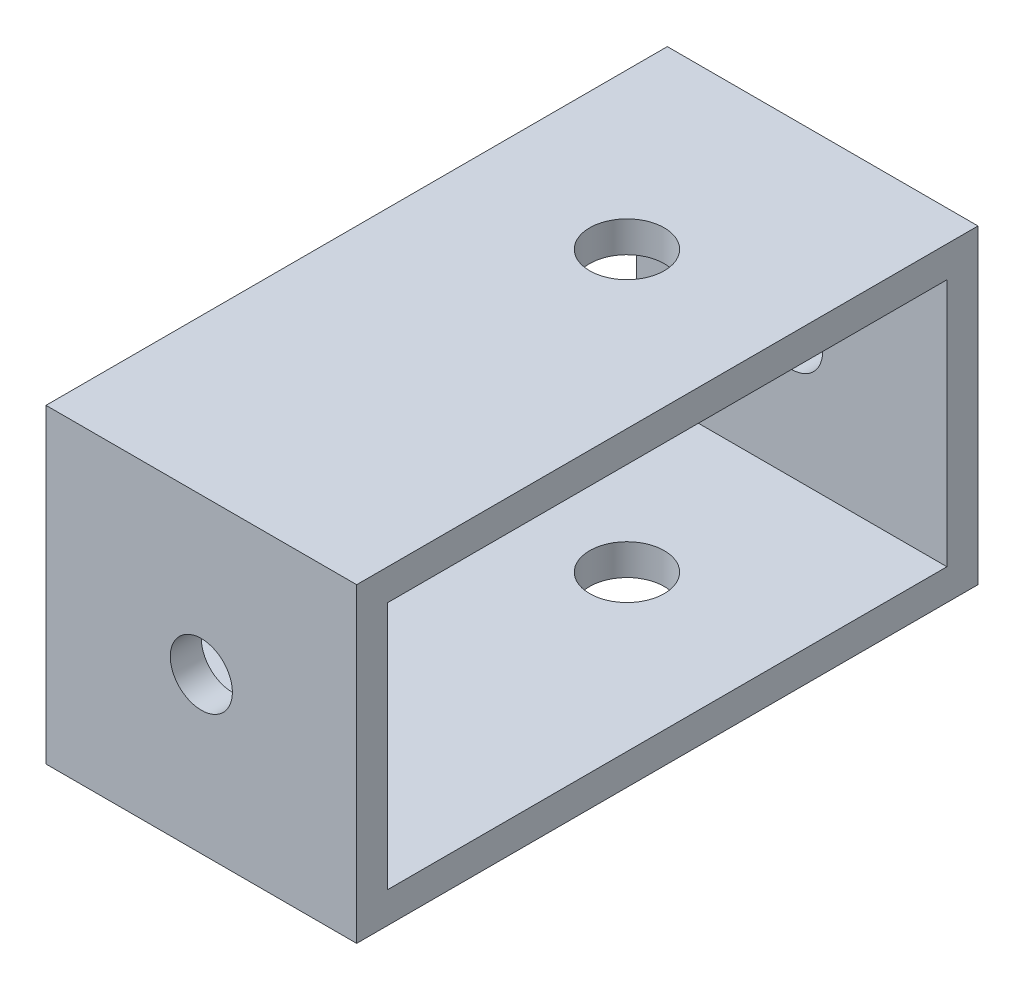
ISO-10303-21;
HEADER;
FILE_DESCRIPTION(('STEP AP214'),'2;1');
FILE_NAME('part.step','',(''),(''),'','','');
FILE_SCHEMA(('AUTOMOTIVE_DESIGN { 1 0 10303 214 1 1 1 1 }'));
ENDSEC;
DATA;
#1=APPLICATION_CONTEXT('core data for automotive mechanical design processes');
#2=APPLICATION_PROTOCOL_DEFINITION('international standard','automotive_design',2000,#1);
#3=PRODUCT_CONTEXT('',#1,'mechanical');
#4=PRODUCT('Part','Part','',(#3));
#5=PRODUCT_RELATED_PRODUCT_CATEGORY('part','',(#4));
#6=PRODUCT_DEFINITION_FORMATION('','',#4);
#7=PRODUCT_DEFINITION_CONTEXT('part definition',#1,'design');
#8=PRODUCT_DEFINITION('design','',#6,#7);
#9=PRODUCT_DEFINITION_SHAPE('','',#8);
#10=(LENGTH_UNIT() NAMED_UNIT(*) SI_UNIT(.MILLI.,.METRE.));
#11=(NAMED_UNIT(*) PLANE_ANGLE_UNIT() SI_UNIT($,.RADIAN.));
#12=(NAMED_UNIT(*) SI_UNIT($,.STERADIAN.) SOLID_ANGLE_UNIT());
#13=UNCERTAINTY_MEASURE_WITH_UNIT(LENGTH_MEASURE(1.E-05),#10,'distance_accuracy_value','');
#14=(GEOMETRIC_REPRESENTATION_CONTEXT(3) GLOBAL_UNCERTAINTY_ASSIGNED_CONTEXT((#13)) GLOBAL_UNIT_ASSIGNED_CONTEXT((#10,
#11,#12)) REPRESENTATION_CONTEXT('',''));
#15=CARTESIAN_POINT('',(0.,0.,0.));
#16=DIRECTION('',(0.,0.,1.));
#17=DIRECTION('',(1.,0.,0.));
#18=AXIS2_PLACEMENT_3D('',#15,#16,#17);
#19=CARTESIAN_POINT('',(25.4,25.4,0.));
#20=DIRECTION('',(0.,1.,0.));
#21=DIRECTION('',(0.,0.,1.));
#22=AXIS2_PLACEMENT_3D('',#19,#20,#21);
#23=PLANE('',#22);
#24=CARTESIAN_POINT('',(12.7,25.4,-34.798));
#25=DIRECTION('',(0.,1.,0.));
#26=DIRECTION('',(0.,0.,1.));
#27=AXIS2_PLACEMENT_3D('',#24,#25,#26);
#28=CIRCLE('',#27,3.048);
#29=CARTESIAN_POINT('',(12.7,25.4,-31.75));
#30=VERTEX_POINT('',#29);
#31=EDGE_CURVE('E202',#30,#30,#28,.T.);
#32=ORIENTED_EDGE('',*,*,#31,.F.);
#33=EDGE_LOOP('',(#32));
#34=FACE_BOUND('',#33,.T.);
#35=DIRECTION('',(0.,0.,-1.));
#36=VECTOR('',#35,1.);
#37=CARTESIAN_POINT('',(0.,25.4,0.));
#38=LINE('',#37,#36);
#39=CARTESIAN_POINT('',(0.,25.4,0.));
#40=VERTEX_POINT('',#39);
#41=CARTESIAN_POINT('',(0.,25.4,-50.8));
#42=VERTEX_POINT('',#41);
#43=EDGE_CURVE('E166',#40,#42,#38,.T.);
#44=ORIENTED_EDGE('',*,*,#43,.F.);
#45=DIRECTION('',(-1.,0.,0.));
#46=VECTOR('',#45,1.);
#47=CARTESIAN_POINT('',(25.4,25.4,0.));
#48=LINE('',#47,#46);
#49=CARTESIAN_POINT('',(25.4,25.4,0.));
#50=VERTEX_POINT('',#49);
#51=EDGE_CURVE('E12',#50,#40,#48,.T.);
#52=ORIENTED_EDGE('',*,*,#51,.F.);
#53=DIRECTION('',(0.,0.,-1.));
#54=VECTOR('',#53,1.);
#55=CARTESIAN_POINT('',(25.4,25.4,0.));
#56=LINE('',#55,#54);
#57=CARTESIAN_POINT('',(25.4,25.4,-50.8));
#58=VERTEX_POINT('',#57);
#59=EDGE_CURVE('E170',#50,#58,#56,.T.);
#60=ORIENTED_EDGE('',*,*,#59,.T.);
#61=DIRECTION('',(-1.,0.,0.));
#62=VECTOR('',#61,1.);
#63=CARTESIAN_POINT('',(25.4,25.4,-50.8));
#64=LINE('',#63,#62);
#65=EDGE_CURVE('E181',#58,#42,#64,.T.);
#66=ORIENTED_EDGE('',*,*,#65,.T.);
#67=EDGE_LOOP('',(#44,#52,#60,#66));
#68=FACE_BOUND('',#67,.T.);
#69=ADVANCED_FACE('F67',(#34,#68),#23,.T.);
#70=CARTESIAN_POINT('',(25.4,25.4,0.));
#71=DIRECTION('',(0.,0.,-1.));
#72=DIRECTION('',(0.,1.,0.));
#73=AXIS2_PLACEMENT_3D('',#70,#71,#72);
#74=PLANE('',#73);
#75=CARTESIAN_POINT('',(12.7,12.7,0.));
#76=DIRECTION('',(0.,0.,1.));
#77=DIRECTION('',(1.,0.,0.));
#78=AXIS2_PLACEMENT_3D('',#75,#76,#77);
#79=CIRCLE('',#78,2.54);
#80=CARTESIAN_POINT('',(15.24,12.7,0.));
#81=VERTEX_POINT('',#80);
#82=EDGE_CURVE('E211',#81,#81,#79,.T.);
#83=ORIENTED_EDGE('',*,*,#82,.F.);
#84=EDGE_LOOP('',(#83));
#85=FACE_BOUND('',#84,.T.);
#86=DIRECTION('',(0.,-1.,0.));
#87=VECTOR('',#86,1.);
#88=CARTESIAN_POINT('',(0.,25.4,0.));
#89=LINE('',#88,#87);
#90=CARTESIAN_POINT('',(0.,0.,0.));
#91=VERTEX_POINT('',#90);
#92=EDGE_CURVE('E174',#40,#91,#89,.T.);
#93=ORIENTED_EDGE('',*,*,#92,.T.);
#94=DIRECTION('',(-1.,0.,0.));
#95=VECTOR('',#94,1.);
#96=CARTESIAN_POINT('',(25.4,0.,0.));
#97=LINE('',#96,#95);
#98=CARTESIAN_POINT('',(25.4,0.,0.));
#99=VERTEX_POINT('',#98);
#100=EDGE_CURVE('E75',#99,#91,#97,.T.);
#101=ORIENTED_EDGE('',*,*,#100,.F.);
#102=DIRECTION('',(0.,-1.,0.));
#103=VECTOR('',#102,1.);
#104=CARTESIAN_POINT('',(25.4,25.4,0.));
#105=LINE('',#104,#103);
#106=EDGE_CURVE('E179',#50,#99,#105,.T.);
#107=ORIENTED_EDGE('',*,*,#106,.F.);
#108=ORIENTED_EDGE('',*,*,#51,.T.);
#109=EDGE_LOOP('',(#93,#101,#107,#108));
#110=FACE_BOUND('',#109,.T.);
#111=ADVANCED_FACE('F237',(#85,#110),#74,.F.);
#112=CARTESIAN_POINT('',(25.4,0.,0.));
#113=DIRECTION('',(0.,1.,0.));
#114=DIRECTION('',(0.,0.,1.));
#115=AXIS2_PLACEMENT_3D('',#112,#113,#114);
#116=PLANE('',#115);
#117=CARTESIAN_POINT('',(12.7,0.,-34.798));
#118=DIRECTION('',(0.,1.,0.));
#119=DIRECTION('',(0.,0.,1.));
#120=AXIS2_PLACEMENT_3D('',#117,#118,#119);
#121=CIRCLE('',#120,3.048);
#122=CARTESIAN_POINT('',(12.7,0.,-31.75));
#123=VERTEX_POINT('',#122);
#124=EDGE_CURVE('E197',#123,#123,#121,.T.);
#125=ORIENTED_EDGE('',*,*,#124,.T.);
#126=EDGE_LOOP('',(#125));
#127=FACE_BOUND('',#126,.T.);
#128=DIRECTION('',(0.,0.,-1.));
#129=VECTOR('',#128,1.);
#130=CARTESIAN_POINT('',(0.,0.,0.));
#131=LINE('',#130,#129);
#132=CARTESIAN_POINT('',(0.,0.,-50.8));
#133=VERTEX_POINT('',#132);
#134=EDGE_CURVE('E187',#91,#133,#131,.T.);
#135=ORIENTED_EDGE('',*,*,#134,.T.);
#136=DIRECTION('',(-1.,0.,0.));
#137=VECTOR('',#136,1.);
#138=CARTESIAN_POINT('',(25.4,0.,-50.8));
#139=LINE('',#138,#137);
#140=CARTESIAN_POINT('',(25.4,0.,-50.8));
#141=VERTEX_POINT('',#140);
#142=EDGE_CURVE('E193',#141,#133,#139,.T.);
#143=ORIENTED_EDGE('',*,*,#142,.F.);
#144=DIRECTION('',(0.,0.,-1.));
#145=VECTOR('',#144,1.);
#146=CARTESIAN_POINT('',(25.4,0.,0.));
#147=LINE('',#146,#145);
#148=EDGE_CURVE('E177',#99,#141,#147,.T.);
#149=ORIENTED_EDGE('',*,*,#148,.F.);
#150=ORIENTED_EDGE('',*,*,#100,.T.);
#151=EDGE_LOOP('',(#135,#143,#149,#150));
#152=FACE_BOUND('',#151,.T.);
#153=ADVANCED_FACE('F242',(#127,#152),#116,.F.);
#154=CARTESIAN_POINT('',(25.4,25.4,-50.8));
#155=DIRECTION('',(0.,0.,-1.));
#156=DIRECTION('',(-1.,0.,0.));
#157=AXIS2_PLACEMENT_3D('',#154,#155,#156);
#158=PLANE('',#157);
#159=CARTESIAN_POINT('',(12.7,12.7,-50.8));
#160=DIRECTION('',(0.,0.,1.));
#161=DIRECTION('',(1.,0.,0.));
#162=AXIS2_PLACEMENT_3D('',#159,#160,#161);
#163=CIRCLE('',#162,2.54);
#164=CARTESIAN_POINT('',(15.24,12.7,-50.8));
#165=VERTEX_POINT('',#164);
#166=EDGE_CURVE('E214',#165,#165,#163,.T.);
#167=ORIENTED_EDGE('',*,*,#166,.T.);
#168=EDGE_LOOP('',(#167));
#169=FACE_BOUND('',#168,.T.);
#170=DIRECTION('',(0.,-1.,0.));
#171=VECTOR('',#170,1.);
#172=CARTESIAN_POINT('',(0.,25.4,-50.8));
#173=LINE('',#172,#171);
#174=EDGE_CURVE('E184',#42,#133,#173,.T.);
#175=ORIENTED_EDGE('',*,*,#174,.F.);
#176=ORIENTED_EDGE('',*,*,#65,.F.);
#177=DIRECTION('',(0.,-1.,0.));
#178=VECTOR('',#177,1.);
#179=CARTESIAN_POINT('',(25.4,25.4,-50.8));
#180=LINE('',#179,#178);
#181=EDGE_CURVE('E173',#58,#141,#180,.T.);
#182=ORIENTED_EDGE('',*,*,#181,.T.);
#183=ORIENTED_EDGE('',*,*,#142,.T.);
#184=EDGE_LOOP('',(#175,#176,#182,#183));
#185=FACE_BOUND('',#184,.T.);
#186=ADVANCED_FACE('F262',(#169,#185),#158,.T.);
#187=CARTESIAN_POINT('',(25.4,0.,0.));
#188=DIRECTION('',(-1.,0.,0.));
#189=DIRECTION('',(0.,0.,1.));
#190=AXIS2_PLACEMENT_3D('',#187,#188,#189);
#191=PLANE('',#190);
#192=DIRECTION('',(0.,-1.,0.));
#193=VECTOR('',#192,1.);
#194=CARTESIAN_POINT('',(25.4,22.86,-2.54));
#195=LINE('',#194,#193);
#196=CARTESIAN_POINT('',(25.4,22.86,-2.54));
#197=VERTEX_POINT('',#196);
#198=CARTESIAN_POINT('',(25.4,2.54,-2.54));
#199=VERTEX_POINT('',#198);
#200=EDGE_CURVE('E137',#197,#199,#195,.T.);
#201=ORIENTED_EDGE('',*,*,#200,.F.);
#202=DIRECTION('',(0.,0.,-1.));
#203=VECTOR('',#202,1.);
#204=CARTESIAN_POINT('',(25.4,22.86,-2.54));
#205=LINE('',#204,#203);
#206=CARTESIAN_POINT('',(25.4,22.86,-48.26));
#207=VERTEX_POINT('',#206);
#208=EDGE_CURVE('E134',#197,#207,#205,.T.);
#209=ORIENTED_EDGE('',*,*,#208,.T.);
#210=DIRECTION('',(0.,-1.,0.));
#211=VECTOR('',#210,1.);
#212=CARTESIAN_POINT('',(25.4,22.86,-48.26));
#213=LINE('',#212,#211);
#214=CARTESIAN_POINT('',(25.4,2.54,-48.26));
#215=VERTEX_POINT('',#214);
#216=EDGE_CURVE('E140',#207,#215,#213,.T.);
#217=ORIENTED_EDGE('',*,*,#216,.T.);
#218=DIRECTION('',(0.,0.,-1.));
#219=VECTOR('',#218,1.);
#220=CARTESIAN_POINT('',(25.4,2.54,-2.54));
#221=LINE('',#220,#219);
#222=EDGE_CURVE('E144',#199,#215,#221,.T.);
#223=ORIENTED_EDGE('',*,*,#222,.F.);
#224=EDGE_LOOP('',(#201,#209,#217,#223));
#225=FACE_BOUND('',#224,.T.);
#226=ORIENTED_EDGE('',*,*,#59,.F.);
#227=ORIENTED_EDGE('',*,*,#106,.T.);
#228=ORIENTED_EDGE('',*,*,#148,.T.);
#229=ORIENTED_EDGE('',*,*,#181,.F.);
#230=EDGE_LOOP('',(#226,#227,#228,#229));
#231=FACE_BOUND('',#230,.T.);
#232=ADVANCED_FACE('F146',(#225,#231),#191,.F.);
#233=CARTESIAN_POINT('',(0.,0.,0.));
#234=DIRECTION('',(-1.,0.,0.));
#235=DIRECTION('',(0.,0.,1.));
#236=AXIS2_PLACEMENT_3D('',#233,#234,#235);
#237=PLANE('',#236);
#238=DIRECTION('',(0.,0.,-1.));
#239=VECTOR('',#238,1.);
#240=CARTESIAN_POINT('',(0.,22.86,-2.54));
#241=LINE('',#240,#239);
#242=CARTESIAN_POINT('',(0.,22.86,-2.54));
#243=VERTEX_POINT('',#242);
#244=CARTESIAN_POINT('',(0.,22.86,-48.26));
#245=VERTEX_POINT('',#244);
#246=EDGE_CURVE('E91',#243,#245,#241,.T.);
#247=ORIENTED_EDGE('',*,*,#246,.F.);
#248=DIRECTION('',(0.,-1.,0.));
#249=VECTOR('',#248,1.);
#250=CARTESIAN_POINT('',(0.,22.86,-2.54));
#251=LINE('',#250,#249);
#252=CARTESIAN_POINT('',(0.,2.54,-2.54));
#253=VERTEX_POINT('',#252);
#254=EDGE_CURVE('E148',#243,#253,#251,.T.);
#255=ORIENTED_EDGE('',*,*,#254,.T.);
#256=DIRECTION('',(0.,0.,-1.));
#257=VECTOR('',#256,1.);
#258=CARTESIAN_POINT('',(0.,2.54,-2.54));
#259=LINE('',#258,#257);
#260=CARTESIAN_POINT('',(0.,2.54,-48.26));
#261=VERTEX_POINT('',#260);
#262=EDGE_CURVE('E151',#253,#261,#259,.T.);
#263=ORIENTED_EDGE('',*,*,#262,.T.);
#264=DIRECTION('',(0.,-1.,0.));
#265=VECTOR('',#264,1.);
#266=CARTESIAN_POINT('',(0.,22.86,-48.26));
#267=LINE('',#266,#265);
#268=EDGE_CURVE('E160',#245,#261,#267,.T.);
#269=ORIENTED_EDGE('',*,*,#268,.F.);
#270=EDGE_LOOP('',(#247,#255,#263,#269));
#271=FACE_BOUND('',#270,.T.);
#272=ORIENTED_EDGE('',*,*,#43,.T.);
#273=ORIENTED_EDGE('',*,*,#174,.T.);
#274=ORIENTED_EDGE('',*,*,#134,.F.);
#275=ORIENTED_EDGE('',*,*,#92,.F.);
#276=EDGE_LOOP('',(#272,#273,#274,#275));
#277=FACE_BOUND('',#276,.T.);
#278=ADVANCED_FACE('F252',(#271,#277),#237,.T.);
#279=CARTESIAN_POINT('',(25.4,22.86,-2.54));
#280=DIRECTION('',(0.,1.,0.));
#281=DIRECTION('',(0.,0.,1.));
#282=AXIS2_PLACEMENT_3D('',#279,#280,#281);
#283=PLANE('',#282);
#284=CARTESIAN_POINT('',(12.7,22.86,-34.798));
#285=DIRECTION('',(0.,1.,0.));
#286=DIRECTION('',(0.,0.,1.));
#287=AXIS2_PLACEMENT_3D('',#284,#285,#286);
#288=CIRCLE('',#287,3.048);
#289=CARTESIAN_POINT('',(12.7,22.86,-31.75));
#290=VERTEX_POINT('',#289);
#291=EDGE_CURVE('E154',#290,#290,#288,.T.);
#292=ORIENTED_EDGE('',*,*,#291,.T.);
#293=EDGE_LOOP('',(#292));
#294=FACE_BOUND('',#293,.T.);
#295=ORIENTED_EDGE('',*,*,#246,.T.);
#296=DIRECTION('',(-1.,0.,0.));
#297=VECTOR('',#296,1.);
#298=CARTESIAN_POINT('',(25.4,22.86,-48.26));
#299=LINE('',#298,#297);
#300=EDGE_CURVE('E131',#207,#245,#299,.T.);
#301=ORIENTED_EDGE('',*,*,#300,.F.);
#302=ORIENTED_EDGE('',*,*,#208,.F.);
#303=DIRECTION('',(-1.,0.,0.));
#304=VECTOR('',#303,1.);
#305=CARTESIAN_POINT('',(25.4,22.86,-2.54));
#306=LINE('',#305,#304);
#307=EDGE_CURVE('E164',#197,#243,#306,.T.);
#308=ORIENTED_EDGE('',*,*,#307,.T.);
#309=EDGE_LOOP('',(#295,#301,#302,#308));
#310=FACE_BOUND('',#309,.T.);
#311=ADVANCED_FACE('F132',(#294,#310),#283,.F.);
#312=CARTESIAN_POINT('',(25.4,22.86,-2.54));
#313=DIRECTION('',(0.,0.,-1.));
#314=DIRECTION('',(-1.,0.,0.));
#315=AXIS2_PLACEMENT_3D('',#312,#313,#314);
#316=PLANE('',#315);
#317=CARTESIAN_POINT('',(12.7,12.7,-2.54));
#318=DIRECTION('',(0.,0.,-1.));
#319=DIRECTION('',(-1.,0.,0.));
#320=AXIS2_PLACEMENT_3D('',#317,#318,#319);
#321=CIRCLE('',#320,2.54);
#322=CARTESIAN_POINT('',(10.16,12.7,-2.54));
#323=VERTEX_POINT('',#322);
#324=EDGE_CURVE('E207',#323,#323,#321,.T.);
#325=ORIENTED_EDGE('',*,*,#324,.F.);
#326=EDGE_LOOP('',(#325));
#327=FACE_BOUND('',#326,.T.);
#328=ORIENTED_EDGE('',*,*,#254,.F.);
#329=ORIENTED_EDGE('',*,*,#307,.F.);
#330=ORIENTED_EDGE('',*,*,#200,.T.);
#331=DIRECTION('',(-1.,0.,0.));
#332=VECTOR('',#331,1.);
#333=CARTESIAN_POINT('',(25.4,2.54,-2.54));
#334=LINE('',#333,#332);
#335=EDGE_CURVE('E167',#199,#253,#334,.T.);
#336=ORIENTED_EDGE('',*,*,#335,.T.);
#337=EDGE_LOOP('',(#328,#329,#330,#336));
#338=FACE_BOUND('',#337,.T.);
#339=ADVANCED_FACE('F276',(#327,#338),#316,.T.);
#340=CARTESIAN_POINT('',(25.4,2.54,-2.54));
#341=DIRECTION('',(0.,1.,0.));
#342=DIRECTION('',(0.,0.,1.));
#343=AXIS2_PLACEMENT_3D('',#340,#341,#342);
#344=PLANE('',#343);
#345=CARTESIAN_POINT('',(12.7,2.54,-34.798));
#346=DIRECTION('',(0.,1.,0.));
#347=DIRECTION('',(0.,0.,1.));
#348=AXIS2_PLACEMENT_3D('',#345,#346,#347);
#349=CIRCLE('',#348,3.048);
#350=CARTESIAN_POINT('',(12.7,2.54,-31.75));
#351=VERTEX_POINT('',#350);
#352=EDGE_CURVE('E195',#351,#351,#349,.T.);
#353=ORIENTED_EDGE('',*,*,#352,.F.);
#354=EDGE_LOOP('',(#353));
#355=FACE_BOUND('',#354,.T.);
#356=ORIENTED_EDGE('',*,*,#262,.F.);
#357=ORIENTED_EDGE('',*,*,#335,.F.);
#358=ORIENTED_EDGE('',*,*,#222,.T.);
#359=DIRECTION('',(-1.,0.,0.));
#360=VECTOR('',#359,1.);
#361=CARTESIAN_POINT('',(25.4,2.54,-48.26));
#362=LINE('',#361,#360);
#363=EDGE_CURVE('E83',#215,#261,#362,.T.);
#364=ORIENTED_EDGE('',*,*,#363,.T.);
#365=EDGE_LOOP('',(#356,#357,#358,#364));
#366=FACE_BOUND('',#365,.T.);
#367=ADVANCED_FACE('F280',(#355,#366),#344,.T.);
#368=CARTESIAN_POINT('',(25.4,22.86,-48.26));
#369=DIRECTION('',(0.,0.,-1.));
#370=DIRECTION('',(-1.,0.,0.));
#371=AXIS2_PLACEMENT_3D('',#368,#369,#370);
#372=PLANE('',#371);
#373=CARTESIAN_POINT('',(12.7,12.7,-48.26));
#374=DIRECTION('',(0.,0.,-1.));
#375=DIRECTION('',(-1.,0.,0.));
#376=AXIS2_PLACEMENT_3D('',#373,#374,#375);
#377=CIRCLE('',#376,2.54);
#378=CARTESIAN_POINT('',(10.16,12.7,-48.26));
#379=VERTEX_POINT('',#378);
#380=EDGE_CURVE('E70',#379,#379,#377,.T.);
#381=ORIENTED_EDGE('',*,*,#380,.T.);
#382=EDGE_LOOP('',(#381));
#383=FACE_BOUND('',#382,.T.);
#384=ORIENTED_EDGE('',*,*,#268,.T.);
#385=ORIENTED_EDGE('',*,*,#363,.F.);
#386=ORIENTED_EDGE('',*,*,#216,.F.);
#387=ORIENTED_EDGE('',*,*,#300,.T.);
#388=EDGE_LOOP('',(#384,#385,#386,#387));
#389=FACE_BOUND('',#388,.T.);
#390=ADVANCED_FACE('F141',(#383,#389),#372,.F.);
#391=CARTESIAN_POINT('',(12.7,0.,-34.798));
#392=DIRECTION('',(0.,1.,0.));
#393=DIRECTION('',(0.,0.,1.));
#394=AXIS2_PLACEMENT_3D('',#391,#392,#393);
#395=CYLINDRICAL_SURFACE('',#394,3.048);
#396=ORIENTED_EDGE('',*,*,#352,.T.);
#397=EDGE_LOOP('',(#396));
#398=FACE_BOUND('',#397,.T.);
#399=ORIENTED_EDGE('',*,*,#124,.F.);
#400=EDGE_LOOP('',(#399));
#401=FACE_BOUND('',#400,.T.);
#402=ADVANCED_FACE('F233',(#398,#401),#395,.F.);
#403=ORIENTED_EDGE('',*,*,#31,.T.);
#404=EDGE_LOOP('',(#403));
#405=FACE_BOUND('',#404,.T.);
#406=ORIENTED_EDGE('',*,*,#291,.F.);
#407=EDGE_LOOP('',(#406));
#408=FACE_BOUND('',#407,.T.);
#409=ADVANCED_FACE('F225',(#405,#408),#395,.F.);
#410=CARTESIAN_POINT('',(12.7,12.7,-50.8));
#411=DIRECTION('',(0.,0.,1.));
#412=DIRECTION('',(1.,0.,0.));
#413=AXIS2_PLACEMENT_3D('',#410,#411,#412);
#414=CYLINDRICAL_SURFACE('',#413,2.54);
#415=ORIENTED_EDGE('',*,*,#166,.F.);
#416=EDGE_LOOP('',(#415));
#417=FACE_BOUND('',#416,.T.);
#418=ORIENTED_EDGE('',*,*,#380,.F.);
#419=EDGE_LOOP('',(#418));
#420=FACE_BOUND('',#419,.T.);
#421=ADVANCED_FACE('F222',(#417,#420),#414,.F.);
#422=ORIENTED_EDGE('',*,*,#324,.T.);
#423=EDGE_LOOP('',(#422));
#424=FACE_BOUND('',#423,.T.);
#425=ORIENTED_EDGE('',*,*,#82,.T.);
#426=EDGE_LOOP('',(#425));
#427=FACE_BOUND('',#426,.T.);
#428=ADVANCED_FACE('F224',(#424,#427),#414,.F.);
#429=CLOSED_SHELL('',(#69,#111,#153,#186,#232,#278,#311,#339,#367,#390,#402,#409,#421,#428));
#430=MANIFOLD_SOLID_BREP('B2',#429);
#431=ADVANCED_BREP_SHAPE_REPRESENTATION('',(#18,#430),#14);
#432=SHAPE_DEFINITION_REPRESENTATION(#9,#431);
ENDSEC;
END-ISO-10303-21;
